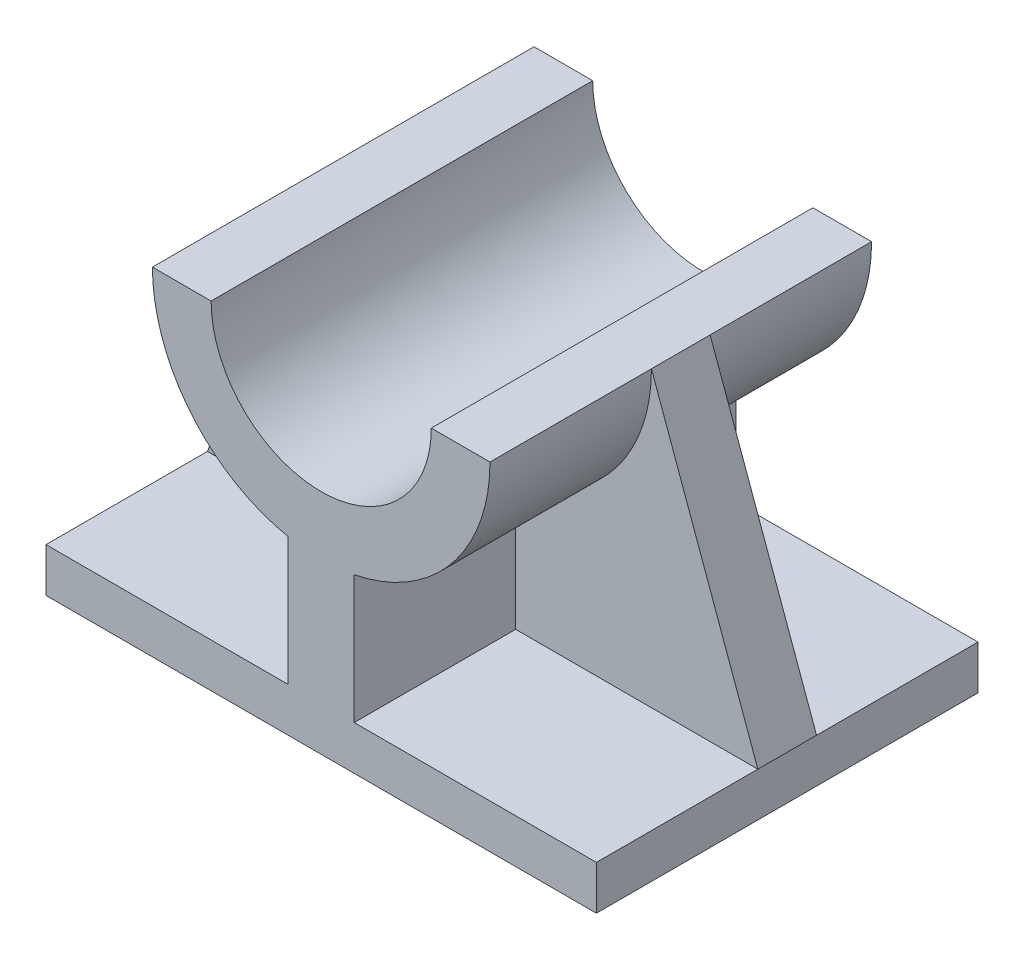
ISO-10303-21;
HEADER;
FILE_DESCRIPTION(('STEP AP214'),'2;1');
FILE_NAME('part.step','',(''),(''),'','','');
FILE_SCHEMA(('AUTOMOTIVE_DESIGN { 1 0 10303 214 1 1 1 1 }'));
ENDSEC;
DATA;
#1=APPLICATION_CONTEXT('core data for automotive mechanical design processes');
#2=APPLICATION_PROTOCOL_DEFINITION('international standard','automotive_design',2000,#1);
#3=PRODUCT_CONTEXT('',#1,'mechanical');
#4=PRODUCT('Part','Part','',(#3));
#5=PRODUCT_RELATED_PRODUCT_CATEGORY('part','',(#4));
#6=PRODUCT_DEFINITION_FORMATION('','',#4);
#7=PRODUCT_DEFINITION_CONTEXT('part definition',#1,'design');
#8=PRODUCT_DEFINITION('design','',#6,#7);
#9=PRODUCT_DEFINITION_SHAPE('','',#8);
#10=(LENGTH_UNIT() NAMED_UNIT(*) SI_UNIT(.MILLI.,.METRE.));
#11=(NAMED_UNIT(*) PLANE_ANGLE_UNIT() SI_UNIT($,.RADIAN.));
#12=(NAMED_UNIT(*) SI_UNIT($,.STERADIAN.) SOLID_ANGLE_UNIT());
#13=UNCERTAINTY_MEASURE_WITH_UNIT(LENGTH_MEASURE(1.E-05),#10,'distance_accuracy_value','');
#14=(GEOMETRIC_REPRESENTATION_CONTEXT(3) GLOBAL_UNCERTAINTY_ASSIGNED_CONTEXT((#13)) GLOBAL_UNIT_ASSIGNED_CONTEXT((#10,
#11,#12)) REPRESENTATION_CONTEXT('',''));
#15=CARTESIAN_POINT('',(0.,0.,0.));
#16=DIRECTION('',(0.,0.,1.));
#17=DIRECTION('',(1.,0.,0.));
#18=AXIS2_PLACEMENT_3D('',#15,#16,#17);
#19=CARTESIAN_POINT('',(0.,43.,26.));
#20=DIRECTION('',(0.,0.,-1.));
#21=DIRECTION('',(-1.,0.,0.));
#22=AXIS2_PLACEMENT_3D('',#19,#20,#21);
#23=CYLINDRICAL_SURFACE('',#22,23.);
#24=CARTESIAN_POINT('',(0.,43.,-4.));
#25=DIRECTION('',(0.,0.,1.));
#26=DIRECTION('',(1.,0.,0.));
#27=AXIS2_PLACEMENT_3D('',#24,#25,#26);
#28=CIRCLE('',#27,23.);
#29=CARTESIAN_POINT('',(-23.,43.,-4.));
#30=VERTEX_POINT('',#29);
#31=CARTESIAN_POINT('',(-4.5,20.4445128627201,-4.));
#32=VERTEX_POINT('',#31);
#33=EDGE_CURVE('E194',#30,#32,#28,.T.);
#34=ORIENTED_EDGE('',*,*,#33,.F.);
#35=DIRECTION('',(0.,0.,-1.));
#36=VECTOR('',#35,1.);
#37=CARTESIAN_POINT('',(-23.,43.,26.));
#38=LINE('',#37,#36);
#39=CARTESIAN_POINT('',(-23.,43.,-26.));
#40=VERTEX_POINT('',#39);
#41=EDGE_CURVE('E53',#30,#40,#38,.T.);
#42=ORIENTED_EDGE('',*,*,#41,.T.);
#43=CARTESIAN_POINT('',(0.,43.,-26.));
#44=DIRECTION('',(0.,0.,1.));
#45=DIRECTION('',(1.,0.,0.));
#46=AXIS2_PLACEMENT_3D('',#43,#44,#45);
#47=CIRCLE('',#46,23.);
#48=CARTESIAN_POINT('',(-4.5,20.4445128627201,-26.));
#49=VERTEX_POINT('',#48);
#50=EDGE_CURVE('E218',#40,#49,#47,.T.);
#51=ORIENTED_EDGE('',*,*,#50,.T.);
#52=DIRECTION('',(0.,0.,-1.));
#53=VECTOR('',#52,1.);
#54=CARTESIAN_POINT('',(-4.5,20.4445128627201,26.));
#55=LINE('',#54,#53);
#56=EDGE_CURVE('E205',#32,#49,#55,.T.);
#57=ORIENTED_EDGE('',*,*,#56,.F.);
#58=EDGE_LOOP('',(#34,#42,#51,#57));
#59=FACE_BOUND('',#58,.T.);
#60=ADVANCED_FACE('F43',(#59),#23,.T.);
#61=CARTESIAN_POINT('',(-4.5,3.,26.));
#62=DIRECTION('',(-1.,0.,0.));
#63=DIRECTION('',(0.,0.,1.));
#64=AXIS2_PLACEMENT_3D('',#61,#62,#63);
#65=PLANE('',#64);
#66=DIRECTION('',(0.,0.,-1.));
#67=VECTOR('',#66,1.);
#68=CARTESIAN_POINT('',(-4.5,3.,26.));
#69=LINE('',#68,#67);
#70=CARTESIAN_POINT('',(-4.5,3.,-4.));
#71=VERTEX_POINT('',#70);
#72=CARTESIAN_POINT('',(-4.5,3.,-26.));
#73=VERTEX_POINT('',#72);
#74=EDGE_CURVE('E225',#71,#73,#69,.T.);
#75=ORIENTED_EDGE('',*,*,#74,.F.);
#76=DIRECTION('',(0.,1.,0.));
#77=VECTOR('',#76,1.);
#78=CARTESIAN_POINT('',(-4.5,3.,-4.));
#79=LINE('',#78,#77);
#80=EDGE_CURVE('E207',#71,#32,#79,.T.);
#81=ORIENTED_EDGE('',*,*,#80,.T.);
#82=ORIENTED_EDGE('',*,*,#56,.T.);
#83=DIRECTION('',(0.,1.,0.));
#84=VECTOR('',#83,1.);
#85=CARTESIAN_POINT('',(-4.5,3.,-26.));
#86=LINE('',#85,#84);
#87=EDGE_CURVE('E320',#73,#49,#86,.T.);
#88=ORIENTED_EDGE('',*,*,#87,.F.);
#89=EDGE_LOOP('',(#75,#81,#82,#88));
#90=FACE_BOUND('',#89,.T.);
#91=ADVANCED_FACE('F471',(#90),#65,.T.);
#92=CARTESIAN_POINT('',(-37.5,3.,26.));
#93=DIRECTION('',(0.,1.,0.));
#94=DIRECTION('',(0.,0.,1.));
#95=AXIS2_PLACEMENT_3D('',#92,#93,#94);
#96=PLANE('',#95);
#97=DIRECTION('',(0.,0.,-1.));
#98=VECTOR('',#97,1.);
#99=CARTESIAN_POINT('',(-37.5,3.,26.));
#100=LINE('',#99,#98);
#101=CARTESIAN_POINT('',(-37.5,3.,-3.99999999999999));
#102=VERTEX_POINT('',#101);
#103=CARTESIAN_POINT('',(-37.5,3.,-26.));
#104=VERTEX_POINT('',#103);
#105=EDGE_CURVE('E231',#102,#104,#100,.T.);
#106=ORIENTED_EDGE('',*,*,#105,.F.);
#107=DIRECTION('',(1.,0.,0.));
#108=VECTOR('',#107,1.);
#109=CARTESIAN_POINT('',(-37.5,3.,-4.));
#110=LINE('',#109,#108);
#111=EDGE_CURVE('E197',#102,#71,#110,.T.);
#112=ORIENTED_EDGE('',*,*,#111,.T.);
#113=ORIENTED_EDGE('',*,*,#74,.T.);
#114=DIRECTION('',(1.,0.,0.));
#115=VECTOR('',#114,1.);
#116=CARTESIAN_POINT('',(-37.5,3.,-26.));
#117=LINE('',#116,#115);
#118=EDGE_CURVE('E317',#104,#73,#117,.T.);
#119=ORIENTED_EDGE('',*,*,#118,.F.);
#120=EDGE_LOOP('',(#106,#112,#113,#119));
#121=FACE_BOUND('',#120,.T.);
#122=ADVANCED_FACE('F477',(#121),#96,.T.);
#123=CARTESIAN_POINT('',(4.5,3.,26.));
#124=DIRECTION('',(0.,1.,0.));
#125=DIRECTION('',(0.,0.,1.));
#126=AXIS2_PLACEMENT_3D('',#123,#124,#125);
#127=PLANE('',#126);
#128=DIRECTION('',(0.,0.,-1.));
#129=VECTOR('',#128,1.);
#130=CARTESIAN_POINT('',(4.5,3.,26.));
#131=LINE('',#130,#129);
#132=CARTESIAN_POINT('',(4.5,3.,-4.));
#133=VERTEX_POINT('',#132);
#134=CARTESIAN_POINT('',(4.5,3.,-26.));
#135=VERTEX_POINT('',#134);
#136=EDGE_CURVE('E247',#133,#135,#131,.T.);
#137=ORIENTED_EDGE('',*,*,#136,.F.);
#138=DIRECTION('',(1.,0.,0.));
#139=VECTOR('',#138,1.);
#140=CARTESIAN_POINT('',(4.5,3.,-4.));
#141=LINE('',#140,#139);
#142=CARTESIAN_POINT('',(37.5,3.,-4.));
#143=VERTEX_POINT('',#142);
#144=EDGE_CURVE('E394',#133,#143,#141,.T.);
#145=ORIENTED_EDGE('',*,*,#144,.T.);
#146=DIRECTION('',(0.,0.,-1.));
#147=VECTOR('',#146,1.);
#148=CARTESIAN_POINT('',(37.5,3.,26.));
#149=LINE('',#148,#147);
#150=CARTESIAN_POINT('',(37.5,3.,-26.));
#151=VERTEX_POINT('',#150);
#152=EDGE_CURVE('E242',#143,#151,#149,.T.);
#153=ORIENTED_EDGE('',*,*,#152,.T.);
#154=DIRECTION('',(1.,0.,0.));
#155=VECTOR('',#154,1.);
#156=CARTESIAN_POINT('',(4.5,3.,-26.));
#157=LINE('',#156,#155);
#158=EDGE_CURVE('E301',#135,#151,#157,.T.);
#159=ORIENTED_EDGE('',*,*,#158,.F.);
#160=EDGE_LOOP('',(#137,#145,#153,#159));
#161=FACE_BOUND('',#160,.T.);
#162=ADVANCED_FACE('F422',(#161),#127,.T.);
#163=CARTESIAN_POINT('',(4.5,3.,26.));
#164=DIRECTION('',(-1.,0.,0.));
#165=DIRECTION('',(0.,0.,1.));
#166=AXIS2_PLACEMENT_3D('',#163,#164,#165);
#167=PLANE('',#166);
#168=DIRECTION('',(0.,1.,0.));
#169=VECTOR('',#168,1.);
#170=CARTESIAN_POINT('',(4.5,3.,-4.));
#171=LINE('',#170,#169);
#172=CARTESIAN_POINT('',(4.5,20.4445128627201,-4.));
#173=VERTEX_POINT('',#172);
#174=EDGE_CURVE('E391',#133,#173,#171,.T.);
#175=ORIENTED_EDGE('',*,*,#174,.F.);
#176=ORIENTED_EDGE('',*,*,#136,.T.);
#177=DIRECTION('',(0.,1.,0.));
#178=VECTOR('',#177,1.);
#179=CARTESIAN_POINT('',(4.5,3.,-26.));
#180=LINE('',#179,#178);
#181=CARTESIAN_POINT('',(4.5,20.4445128627201,-26.));
#182=VERTEX_POINT('',#181);
#183=EDGE_CURVE('E297',#135,#182,#180,.T.);
#184=ORIENTED_EDGE('',*,*,#183,.T.);
#185=DIRECTION('',(0.,0.,-1.));
#186=VECTOR('',#185,1.);
#187=CARTESIAN_POINT('',(4.5,20.4445128627201,26.));
#188=LINE('',#187,#186);
#189=EDGE_CURVE('E252',#173,#182,#188,.T.);
#190=ORIENTED_EDGE('',*,*,#189,.F.);
#191=EDGE_LOOP('',(#175,#176,#184,#190));
#192=FACE_BOUND('',#191,.T.);
#193=ADVANCED_FACE('F457',(#192),#167,.F.);
#194=CARTESIAN_POINT('',(0.,43.,26.));
#195=DIRECTION('',(0.,0.,-1.));
#196=DIRECTION('',(-1.,0.,0.));
#197=AXIS2_PLACEMENT_3D('',#194,#195,#196);
#198=CYLINDRICAL_SURFACE('',#197,23.);
#199=CARTESIAN_POINT('',(0.,43.,-4.));
#200=DIRECTION('',(0.,0.,1.));
#201=DIRECTION('',(1.,0.,0.));
#202=AXIS2_PLACEMENT_3D('',#199,#200,#201);
#203=CIRCLE('',#202,23.);
#204=CARTESIAN_POINT('',(23.,43.,-3.99999999999999));
#205=VERTEX_POINT('',#204);
#206=EDGE_CURVE('E386',#173,#205,#203,.T.);
#207=ORIENTED_EDGE('',*,*,#206,.F.);
#208=ORIENTED_EDGE('',*,*,#189,.T.);
#209=CARTESIAN_POINT('',(0.,43.,-26.));
#210=DIRECTION('',(0.,0.,1.));
#211=DIRECTION('',(1.,0.,0.));
#212=AXIS2_PLACEMENT_3D('',#209,#210,#211);
#213=CIRCLE('',#212,23.);
#214=CARTESIAN_POINT('',(23.,43.,-26.));
#215=VERTEX_POINT('',#214);
#216=EDGE_CURVE('E293',#182,#215,#213,.T.);
#217=ORIENTED_EDGE('',*,*,#216,.T.);
#218=DIRECTION('',(0.,0.,-1.));
#219=VECTOR('',#218,1.);
#220=CARTESIAN_POINT('',(23.,43.,26.));
#221=LINE('',#220,#219);
#222=EDGE_CURVE('E257',#205,#215,#221,.T.);
#223=ORIENTED_EDGE('',*,*,#222,.F.);
#224=EDGE_LOOP('',(#207,#208,#217,#223));
#225=FACE_BOUND('',#224,.T.);
#226=ADVANCED_FACE('F459',(#225),#198,.T.);
#227=CARTESIAN_POINT('',(-23.,43.,26.));
#228=DIRECTION('',(0.,1.,0.));
#229=DIRECTION('',(0.,0.,1.));
#230=AXIS2_PLACEMENT_3D('',#227,#228,#229);
#231=PLANE('',#230);
#232=DIRECTION('',(0.,0.,-1.));
#233=VECTOR('',#232,1.);
#234=CARTESIAN_POINT('',(-15.,43.,26.));
#235=LINE('',#234,#233);
#236=CARTESIAN_POINT('',(-15.,43.,26.));
#237=VERTEX_POINT('',#236);
#238=CARTESIAN_POINT('',(-15.,43.,-26.));
#239=VERTEX_POINT('',#238);
#240=EDGE_CURVE('E47',#237,#239,#235,.T.);
#241=ORIENTED_EDGE('',*,*,#240,.T.);
#242=DIRECTION('',(1.,0.,0.));
#243=VECTOR('',#242,1.);
#244=CARTESIAN_POINT('',(-23.,43.,-26.));
#245=LINE('',#244,#243);
#246=EDGE_CURVE('E211',#40,#239,#245,.T.);
#247=ORIENTED_EDGE('',*,*,#246,.F.);
#248=ORIENTED_EDGE('',*,*,#41,.F.);
#249=DIRECTION('',(0.,0.,-1.));
#250=VECTOR('',#249,1.);
#251=CARTESIAN_POINT('',(-23.,43.,26.));
#252=LINE('',#251,#250);
#253=CARTESIAN_POINT('',(-23.,43.,4.));
#254=VERTEX_POINT('',#253);
#255=EDGE_CURVE('E182',#30,#254,#252,.F.);
#256=ORIENTED_EDGE('',*,*,#255,.T.);
#257=CARTESIAN_POINT('',(-23.,43.,26.));
#258=VERTEX_POINT('',#257);
#259=EDGE_CURVE('E11',#258,#254,#38,.T.);
#260=ORIENTED_EDGE('',*,*,#259,.F.);
#261=DIRECTION('',(1.,0.,0.));
#262=VECTOR('',#261,1.);
#263=CARTESIAN_POINT('',(-23.,43.,26.));
#264=LINE('',#263,#262);
#265=EDGE_CURVE('E326',#258,#237,#264,.T.);
#266=ORIENTED_EDGE('',*,*,#265,.T.);
#267=EDGE_LOOP('',(#241,#247,#248,#256,#260,#266));
#268=FACE_BOUND('',#267,.T.);
#269=ADVANCED_FACE('F45',(#268),#231,.T.);
#270=ORIENTED_EDGE('',*,*,#259,.T.);
#271=CARTESIAN_POINT('',(0.,43.,4.));
#272=DIRECTION('',(0.,0.,1.));
#273=DIRECTION('',(1.,0.,0.));
#274=AXIS2_PLACEMENT_3D('',#271,#272,#273);
#275=CIRCLE('',#274,23.);
#276=CARTESIAN_POINT('',(-4.5,20.4445128627201,4.));
#277=VERTEX_POINT('',#276);
#278=EDGE_CURVE('E374',#254,#277,#275,.T.);
#279=ORIENTED_EDGE('',*,*,#278,.T.);
#280=CARTESIAN_POINT('',(-4.5,20.4445128627201,26.));
#281=VERTEX_POINT('',#280);
#282=EDGE_CURVE('E213',#281,#277,#55,.T.);
#283=ORIENTED_EDGE('',*,*,#282,.F.);
#284=CARTESIAN_POINT('',(0.,43.,26.));
#285=DIRECTION('',(0.,0.,1.));
#286=DIRECTION('',(1.,0.,0.));
#287=AXIS2_PLACEMENT_3D('',#284,#285,#286);
#288=CIRCLE('',#287,23.);
#289=EDGE_CURVE('E266',#258,#281,#288,.T.);
#290=ORIENTED_EDGE('',*,*,#289,.F.);
#291=EDGE_LOOP('',(#270,#279,#283,#290));
#292=FACE_BOUND('',#291,.T.);
#293=ADVANCED_FACE('F473',(#292),#23,.T.);
#294=DIRECTION('',(0.,1.,0.));
#295=VECTOR('',#294,1.);
#296=CARTESIAN_POINT('',(-4.5,3.,4.));
#297=LINE('',#296,#295);
#298=CARTESIAN_POINT('',(-4.5,3.,4.));
#299=VERTEX_POINT('',#298);
#300=EDGE_CURVE('E370',#299,#277,#297,.T.);
#301=ORIENTED_EDGE('',*,*,#300,.F.);
#302=CARTESIAN_POINT('',(-4.5,3.,26.));
#303=VERTEX_POINT('',#302);
#304=EDGE_CURVE('E221',#303,#299,#69,.T.);
#305=ORIENTED_EDGE('',*,*,#304,.F.);
#306=DIRECTION('',(0.,1.,0.));
#307=VECTOR('',#306,1.);
#308=CARTESIAN_POINT('',(-4.5,3.,26.));
#309=LINE('',#308,#307);
#310=EDGE_CURVE('E269',#303,#281,#309,.T.);
#311=ORIENTED_EDGE('',*,*,#310,.T.);
#312=ORIENTED_EDGE('',*,*,#282,.T.);
#313=EDGE_LOOP('',(#301,#305,#311,#312));
#314=FACE_BOUND('',#313,.T.);
#315=ADVANCED_FACE('F369',(#314),#65,.T.);
#316=DIRECTION('',(1.,0.,0.));
#317=VECTOR('',#316,1.);
#318=CARTESIAN_POINT('',(-37.5,3.,4.));
#319=LINE('',#318,#317);
#320=CARTESIAN_POINT('',(-37.5,3.00000000000003,4.));
#321=VERTEX_POINT('',#320);
#322=EDGE_CURVE('E189',#321,#299,#319,.T.);
#323=ORIENTED_EDGE('',*,*,#322,.F.);
#324=CARTESIAN_POINT('',(-37.5,3.,26.));
#325=VERTEX_POINT('',#324);
#326=EDGE_CURVE('E226',#325,#321,#100,.T.);
#327=ORIENTED_EDGE('',*,*,#326,.F.);
#328=DIRECTION('',(1.,0.,0.));
#329=VECTOR('',#328,1.);
#330=CARTESIAN_POINT('',(-37.5,3.,26.));
#331=LINE('',#330,#329);
#332=EDGE_CURVE('E278',#325,#303,#331,.T.);
#333=ORIENTED_EDGE('',*,*,#332,.T.);
#334=ORIENTED_EDGE('',*,*,#304,.T.);
#335=EDGE_LOOP('',(#323,#327,#333,#334));
#336=FACE_BOUND('',#335,.T.);
#337=ADVANCED_FACE('F363',(#336),#96,.T.);
#338=CARTESIAN_POINT('',(-37.5,3.,26.));
#339=DIRECTION('',(1.,0.,0.));
#340=DIRECTION('',(0.,0.,-1.));
#341=AXIS2_PLACEMENT_3D('',#338,#339,#340);
#342=PLANE('',#341);
#343=ORIENTED_EDGE('',*,*,#326,.T.);
#344=EDGE_CURVE('E230',#321,#102,#100,.T.);
#345=ORIENTED_EDGE('',*,*,#344,.T.);
#346=ORIENTED_EDGE('',*,*,#105,.T.);
#347=DIRECTION('',(0.,-1.,0.));
#348=VECTOR('',#347,1.);
#349=CARTESIAN_POINT('',(-37.5,3.,-26.));
#350=LINE('',#349,#348);
#351=CARTESIAN_POINT('',(-37.5,-3.,-26.));
#352=VERTEX_POINT('',#351);
#353=EDGE_CURVE('E313',#104,#352,#350,.T.);
#354=ORIENTED_EDGE('',*,*,#353,.T.);
#355=DIRECTION('',(0.,0.,-1.));
#356=VECTOR('',#355,1.);
#357=CARTESIAN_POINT('',(-37.5,-3.,26.));
#358=LINE('',#357,#356);
#359=CARTESIAN_POINT('',(-37.5,-3.,26.));
#360=VERTEX_POINT('',#359);
#361=EDGE_CURVE('E232',#360,#352,#358,.T.);
#362=ORIENTED_EDGE('',*,*,#361,.F.);
#363=DIRECTION('',(0.,-1.,0.));
#364=VECTOR('',#363,1.);
#365=CARTESIAN_POINT('',(-37.5,3.,26.));
#366=LINE('',#365,#364);
#367=EDGE_CURVE('E356',#325,#360,#366,.T.);
#368=ORIENTED_EDGE('',*,*,#367,.F.);
#369=EDGE_LOOP('',(#343,#345,#346,#354,#362,#368));
#370=FACE_BOUND('',#369,.T.);
#371=ADVANCED_FACE('F492',(#370),#342,.F.);
#372=CARTESIAN_POINT('',(-37.5,-3.,26.));
#373=DIRECTION('',(0.,1.,0.));
#374=DIRECTION('',(0.,0.,1.));
#375=AXIS2_PLACEMENT_3D('',#372,#373,#374);
#376=PLANE('',#375);
#377=ORIENTED_EDGE('',*,*,#361,.T.);
#378=DIRECTION('',(1.,0.,0.));
#379=VECTOR('',#378,1.);
#380=CARTESIAN_POINT('',(-37.5,-3.,-26.));
#381=LINE('',#380,#379);
#382=CARTESIAN_POINT('',(37.5,-3.,-26.));
#383=VERTEX_POINT('',#382);
#384=EDGE_CURVE('E309',#352,#383,#381,.T.);
#385=ORIENTED_EDGE('',*,*,#384,.T.);
#386=DIRECTION('',(0.,0.,-1.));
#387=VECTOR('',#386,1.);
#388=CARTESIAN_POINT('',(37.5,-3.,26.));
#389=LINE('',#388,#387);
#390=CARTESIAN_POINT('',(37.5,-3.,26.));
#391=VERTEX_POINT('',#390);
#392=EDGE_CURVE('E235',#391,#383,#389,.T.);
#393=ORIENTED_EDGE('',*,*,#392,.F.);
#394=DIRECTION('',(1.,0.,0.));
#395=VECTOR('',#394,1.);
#396=CARTESIAN_POINT('',(-37.5,-3.,26.));
#397=LINE('',#396,#395);
#398=EDGE_CURVE('E353',#360,#391,#397,.T.);
#399=ORIENTED_EDGE('',*,*,#398,.F.);
#400=EDGE_LOOP('',(#377,#385,#393,#399));
#401=FACE_BOUND('',#400,.T.);
#402=ADVANCED_FACE('F449',(#401),#376,.F.);
#403=CARTESIAN_POINT('',(37.5,3.,26.));
#404=DIRECTION('',(1.,0.,0.));
#405=DIRECTION('',(0.,0.,-1.));
#406=AXIS2_PLACEMENT_3D('',#403,#404,#405);
#407=PLANE('',#406);
#408=ORIENTED_EDGE('',*,*,#392,.T.);
#409=DIRECTION('',(0.,-1.,0.));
#410=VECTOR('',#409,1.);
#411=CARTESIAN_POINT('',(37.5,3.,-26.));
#412=LINE('',#411,#410);
#413=EDGE_CURVE('E305',#151,#383,#412,.T.);
#414=ORIENTED_EDGE('',*,*,#413,.F.);
#415=ORIENTED_EDGE('',*,*,#152,.F.);
#416=DIRECTION('',(0.,0.,1.));
#417=VECTOR('',#416,1.);
#418=CARTESIAN_POINT('',(37.5,3.,26.));
#419=LINE('',#418,#417);
#420=CARTESIAN_POINT('',(37.5,3.,4.));
#421=VERTEX_POINT('',#420);
#422=EDGE_CURVE('E285',#421,#143,#419,.F.);
#423=ORIENTED_EDGE('',*,*,#422,.F.);
#424=CARTESIAN_POINT('',(37.5,3.,26.));
#425=VERTEX_POINT('',#424);
#426=EDGE_CURVE('E238',#425,#421,#149,.T.);
#427=ORIENTED_EDGE('',*,*,#426,.F.);
#428=DIRECTION('',(0.,-1.,0.));
#429=VECTOR('',#428,1.);
#430=CARTESIAN_POINT('',(37.5,3.,26.));
#431=LINE('',#430,#429);
#432=EDGE_CURVE('E349',#425,#391,#431,.T.);
#433=ORIENTED_EDGE('',*,*,#432,.T.);
#434=EDGE_LOOP('',(#408,#414,#415,#423,#427,#433));
#435=FACE_BOUND('',#434,.T.);
#436=ADVANCED_FACE('F425',(#435),#407,.T.);
#437=DIRECTION('',(1.,0.,0.));
#438=VECTOR('',#437,1.);
#439=CARTESIAN_POINT('',(4.5,3.,4.));
#440=LINE('',#439,#438);
#441=CARTESIAN_POINT('',(4.5,3.,4.));
#442=VERTEX_POINT('',#441);
#443=EDGE_CURVE('E405',#442,#421,#440,.T.);
#444=ORIENTED_EDGE('',*,*,#443,.F.);
#445=CARTESIAN_POINT('',(4.5,3.,26.));
#446=VERTEX_POINT('',#445);
#447=EDGE_CURVE('E243',#446,#442,#131,.T.);
#448=ORIENTED_EDGE('',*,*,#447,.F.);
#449=DIRECTION('',(1.,0.,0.));
#450=VECTOR('',#449,1.);
#451=CARTESIAN_POINT('',(4.5,3.,26.));
#452=LINE('',#451,#450);
#453=EDGE_CURVE('E345',#446,#425,#452,.T.);
#454=ORIENTED_EDGE('',*,*,#453,.T.);
#455=ORIENTED_EDGE('',*,*,#426,.T.);
#456=EDGE_LOOP('',(#444,#448,#454,#455));
#457=FACE_BOUND('',#456,.T.);
#458=ADVANCED_FACE('F444',(#457),#127,.T.);
#459=ORIENTED_EDGE('',*,*,#447,.T.);
#460=DIRECTION('',(0.,1.,0.));
#461=VECTOR('',#460,1.);
#462=CARTESIAN_POINT('',(4.5,3.,4.));
#463=LINE('',#462,#461);
#464=CARTESIAN_POINT('',(4.5,20.4445128627201,4.));
#465=VERTEX_POINT('',#464);
#466=EDGE_CURVE('E402',#442,#465,#463,.T.);
#467=ORIENTED_EDGE('',*,*,#466,.T.);
#468=CARTESIAN_POINT('',(4.5,20.4445128627201,26.));
#469=VERTEX_POINT('',#468);
#470=EDGE_CURVE('E248',#469,#465,#188,.T.);
#471=ORIENTED_EDGE('',*,*,#470,.F.);
#472=DIRECTION('',(0.,1.,0.));
#473=VECTOR('',#472,1.);
#474=CARTESIAN_POINT('',(4.5,3.,26.));
#475=LINE('',#474,#473);
#476=EDGE_CURVE('E342',#446,#469,#475,.T.);
#477=ORIENTED_EDGE('',*,*,#476,.F.);
#478=EDGE_LOOP('',(#459,#467,#471,#477));
#479=FACE_BOUND('',#478,.T.);
#480=ADVANCED_FACE('F441',(#479),#167,.F.);
#481=ORIENTED_EDGE('',*,*,#470,.T.);
#482=CARTESIAN_POINT('',(0.,43.,4.));
#483=DIRECTION('',(0.,0.,1.));
#484=DIRECTION('',(1.,0.,0.));
#485=AXIS2_PLACEMENT_3D('',#482,#483,#484);
#486=CIRCLE('',#485,23.);
#487=CARTESIAN_POINT('',(23.,43.,4.));
#488=VERTEX_POINT('',#487);
#489=EDGE_CURVE('E398',#465,#488,#486,.T.);
#490=ORIENTED_EDGE('',*,*,#489,.T.);
#491=CARTESIAN_POINT('',(23.,43.,26.));
#492=VERTEX_POINT('',#491);
#493=EDGE_CURVE('E253',#492,#488,#221,.T.);
#494=ORIENTED_EDGE('',*,*,#493,.F.);
#495=CARTESIAN_POINT('',(0.,43.,26.));
#496=DIRECTION('',(0.,0.,1.));
#497=DIRECTION('',(1.,0.,0.));
#498=AXIS2_PLACEMENT_3D('',#495,#496,#497);
#499=CIRCLE('',#498,23.);
#500=EDGE_CURVE('E339',#469,#492,#499,.T.);
#501=ORIENTED_EDGE('',*,*,#500,.F.);
#502=EDGE_LOOP('',(#481,#490,#494,#501));
#503=FACE_BOUND('',#502,.T.);
#504=ADVANCED_FACE('F436',(#503),#198,.T.);
#505=CARTESIAN_POINT('',(15.,43.,26.));
#506=DIRECTION('',(0.,1.,0.));
#507=DIRECTION('',(0.,0.,1.));
#508=AXIS2_PLACEMENT_3D('',#505,#506,#507);
#509=PLANE('',#508);
#510=ORIENTED_EDGE('',*,*,#493,.T.);
#511=EDGE_CURVE('E256',#488,#205,#221,.T.);
#512=ORIENTED_EDGE('',*,*,#511,.T.);
#513=ORIENTED_EDGE('',*,*,#222,.T.);
#514=DIRECTION('',(1.,0.,0.));
#515=VECTOR('',#514,1.);
#516=CARTESIAN_POINT('',(15.,43.,-26.));
#517=LINE('',#516,#515);
#518=CARTESIAN_POINT('',(15.,43.,-26.));
#519=VERTEX_POINT('',#518);
#520=EDGE_CURVE('E289',#519,#215,#517,.T.);
#521=ORIENTED_EDGE('',*,*,#520,.F.);
#522=DIRECTION('',(0.,0.,-1.));
#523=VECTOR('',#522,1.);
#524=CARTESIAN_POINT('',(15.,43.,26.));
#525=LINE('',#524,#523);
#526=CARTESIAN_POINT('',(15.,43.,26.));
#527=VERTEX_POINT('',#526);
#528=EDGE_CURVE('E258',#527,#519,#525,.T.);
#529=ORIENTED_EDGE('',*,*,#528,.F.);
#530=DIRECTION('',(1.,0.,0.));
#531=VECTOR('',#530,1.);
#532=CARTESIAN_POINT('',(15.,43.,26.));
#533=LINE('',#532,#531);
#534=EDGE_CURVE('E331',#527,#492,#533,.T.);
#535=ORIENTED_EDGE('',*,*,#534,.T.);
#536=EDGE_LOOP('',(#510,#512,#513,#521,#529,#535));
#537=FACE_BOUND('',#536,.T.);
#538=ADVANCED_FACE('F432',(#537),#509,.T.);
#539=CARTESIAN_POINT('',(0.,43.,26.));
#540=DIRECTION('',(0.,0.,-1.));
#541=DIRECTION('',(-1.,0.,0.));
#542=AXIS2_PLACEMENT_3D('',#539,#540,#541);
#543=CYLINDRICAL_SURFACE('',#542,15.);
#544=ORIENTED_EDGE('',*,*,#528,.T.);
#545=CARTESIAN_POINT('',(0.,43.,-26.));
#546=DIRECTION('',(0.,0.,1.));
#547=DIRECTION('',(1.,0.,0.));
#548=AXIS2_PLACEMENT_3D('',#545,#546,#547);
#549=CIRCLE('',#548,15.);
#550=EDGE_CURVE('E284',#239,#519,#549,.T.);
#551=ORIENTED_EDGE('',*,*,#550,.F.);
#552=ORIENTED_EDGE('',*,*,#240,.F.);
#553=CARTESIAN_POINT('',(0.,43.,26.));
#554=DIRECTION('',(0.,0.,1.));
#555=DIRECTION('',(1.,0.,0.));
#556=AXIS2_PLACEMENT_3D('',#553,#554,#555);
#557=CIRCLE('',#556,15.);
#558=EDGE_CURVE('E328',#237,#527,#557,.T.);
#559=ORIENTED_EDGE('',*,*,#558,.T.);
#560=EDGE_LOOP('',(#544,#551,#552,#559));
#561=FACE_BOUND('',#560,.T.);
#562=ADVANCED_FACE('F462',(#561),#543,.F.);
#563=CARTESIAN_POINT('',(0.,43.,26.));
#564=DIRECTION('',(0.,0.,1.));
#565=DIRECTION('',(1.,0.,0.));
#566=AXIS2_PLACEMENT_3D('',#563,#564,#565);
#567=PLANE('',#566);
#568=ORIENTED_EDGE('',*,*,#265,.F.);
#569=ORIENTED_EDGE('',*,*,#289,.T.);
#570=ORIENTED_EDGE('',*,*,#310,.F.);
#571=ORIENTED_EDGE('',*,*,#332,.F.);
#572=ORIENTED_EDGE('',*,*,#367,.T.);
#573=ORIENTED_EDGE('',*,*,#398,.T.);
#574=ORIENTED_EDGE('',*,*,#432,.F.);
#575=ORIENTED_EDGE('',*,*,#453,.F.);
#576=ORIENTED_EDGE('',*,*,#476,.T.);
#577=ORIENTED_EDGE('',*,*,#500,.T.);
#578=ORIENTED_EDGE('',*,*,#534,.F.);
#579=ORIENTED_EDGE('',*,*,#558,.F.);
#580=EDGE_LOOP('',(#568,#569,#570,#571,#572,#573,#574,#575,#576,#577,#578,#579));
#581=FACE_BOUND('',#580,.T.);
#582=ADVANCED_FACE('F365',(#581),#567,.T.);
#583=CARTESIAN_POINT('',(0.,43.,-26.));
#584=DIRECTION('',(0.,0.,1.));
#585=DIRECTION('',(1.,0.,0.));
#586=AXIS2_PLACEMENT_3D('',#583,#584,#585);
#587=PLANE('',#586);
#588=ORIENTED_EDGE('',*,*,#246,.T.);
#589=ORIENTED_EDGE('',*,*,#550,.T.);
#590=ORIENTED_EDGE('',*,*,#520,.T.);
#591=ORIENTED_EDGE('',*,*,#216,.F.);
#592=ORIENTED_EDGE('',*,*,#183,.F.);
#593=ORIENTED_EDGE('',*,*,#158,.T.);
#594=ORIENTED_EDGE('',*,*,#413,.T.);
#595=ORIENTED_EDGE('',*,*,#384,.F.);
#596=ORIENTED_EDGE('',*,*,#353,.F.);
#597=ORIENTED_EDGE('',*,*,#118,.T.);
#598=ORIENTED_EDGE('',*,*,#87,.T.);
#599=ORIENTED_EDGE('',*,*,#50,.F.);
#600=EDGE_LOOP('',(#588,#589,#590,#591,#592,#593,#594,#595,#596,#597,#598,#599));
#601=FACE_BOUND('',#600,.T.);
#602=ADVANCED_FACE('F452',(#601),#587,.F.);
#603=CARTESIAN_POINT('',(23.,43.,0.));
#604=DIRECTION('',(-0.940136065162483,-0.3407993236214,0.));
#605=DIRECTION('',(0.3407993236214,-0.940136065162483,0.));
#606=AXIS2_PLACEMENT_3D('',#603,#604,#605);
#607=PLANE('',#606);
#608=DIRECTION('',(0.3407993236214,-0.940136065162483,0.));
#609=VECTOR('',#608,1.);
#610=CARTESIAN_POINT('',(23.,43.,4.));
#611=LINE('',#610,#609);
#612=EDGE_CURVE('E382',#488,#421,#611,.T.);
#613=ORIENTED_EDGE('',*,*,#612,.T.);
#614=ORIENTED_EDGE('',*,*,#422,.T.);
#615=DIRECTION('',(0.3407993236214,-0.940136065162483,0.));
#616=VECTOR('',#615,1.);
#617=CARTESIAN_POINT('',(23.,43.,-4.));
#618=LINE('',#617,#616);
#619=EDGE_CURVE('E69',#205,#143,#618,.T.);
#620=ORIENTED_EDGE('',*,*,#619,.F.);
#621=ORIENTED_EDGE('',*,*,#511,.F.);
#622=EDGE_LOOP('',(#613,#614,#620,#621));
#623=FACE_BOUND('',#622,.T.);
#624=ADVANCED_FACE('F412',(#623),#607,.F.);
#625=CARTESIAN_POINT('',(0.,20.,4.));
#626=DIRECTION('',(0.,0.,1.));
#627=DIRECTION('',(1.,0.,0.));
#628=AXIS2_PLACEMENT_3D('',#625,#626,#627);
#629=PLANE('',#628);
#630=ORIENTED_EDGE('',*,*,#466,.F.);
#631=ORIENTED_EDGE('',*,*,#443,.T.);
#632=ORIENTED_EDGE('',*,*,#612,.F.);
#633=ORIENTED_EDGE('',*,*,#489,.F.);
#634=EDGE_LOOP('',(#630,#631,#632,#633));
#635=FACE_BOUND('',#634,.T.);
#636=ADVANCED_FACE('F434',(#635),#629,.T.);
#637=CARTESIAN_POINT('',(0.,20.,-4.));
#638=DIRECTION('',(0.,0.,1.));
#639=DIRECTION('',(1.,0.,0.));
#640=AXIS2_PLACEMENT_3D('',#637,#638,#639);
#641=PLANE('',#640);
#642=ORIENTED_EDGE('',*,*,#144,.F.);
#643=ORIENTED_EDGE('',*,*,#174,.T.);
#644=ORIENTED_EDGE('',*,*,#206,.T.);
#645=ORIENTED_EDGE('',*,*,#619,.T.);
#646=EDGE_LOOP('',(#642,#643,#644,#645));
#647=FACE_BOUND('',#646,.T.);
#648=ADVANCED_FACE('F416',(#647),#641,.F.);
#649=CARTESIAN_POINT('',(-23.,43.,0.));
#650=DIRECTION('',(-0.940136065162483,0.3407993236214,0.));
#651=DIRECTION('',(-0.3407993236214,-0.940136065162483,0.));
#652=AXIS2_PLACEMENT_3D('',#649,#650,#651);
#653=PLANE('',#652);
#654=ORIENTED_EDGE('',*,*,#255,.F.);
#655=DIRECTION('',(-0.3407993236214,-0.940136065162483,0.));
#656=VECTOR('',#655,1.);
#657=CARTESIAN_POINT('',(-23.,43.,-4.));
#658=LINE('',#657,#656);
#659=EDGE_CURVE('E61',#30,#102,#658,.T.);
#660=ORIENTED_EDGE('',*,*,#659,.T.);
#661=ORIENTED_EDGE('',*,*,#344,.F.);
#662=DIRECTION('',(-0.3407993236214,-0.940136065162483,0.));
#663=VECTOR('',#662,1.);
#664=CARTESIAN_POINT('',(-23.,43.,4.));
#665=LINE('',#664,#663);
#666=EDGE_CURVE('E185',#254,#321,#665,.T.);
#667=ORIENTED_EDGE('',*,*,#666,.F.);
#668=EDGE_LOOP('',(#654,#660,#661,#667));
#669=FACE_BOUND('',#668,.T.);
#670=ADVANCED_FACE('F183',(#669),#653,.T.);
#671=CARTESIAN_POINT('',(0.,20.,-4.));
#672=DIRECTION('',(0.,0.,1.));
#673=DIRECTION('',(1.,0.,0.));
#674=AXIS2_PLACEMENT_3D('',#671,#672,#673);
#675=PLANE('',#674);
#676=ORIENTED_EDGE('',*,*,#111,.F.);
#677=ORIENTED_EDGE('',*,*,#659,.F.);
#678=ORIENTED_EDGE('',*,*,#33,.T.);
#679=ORIENTED_EDGE('',*,*,#80,.F.);
#680=EDGE_LOOP('',(#676,#677,#678,#679));
#681=FACE_BOUND('',#680,.T.);
#682=ADVANCED_FACE('F193',(#681),#675,.F.);
#683=CARTESIAN_POINT('',(0.,20.,4.));
#684=DIRECTION('',(0.,0.,1.));
#685=DIRECTION('',(1.,0.,0.));
#686=AXIS2_PLACEMENT_3D('',#683,#684,#685);
#687=PLANE('',#686);
#688=ORIENTED_EDGE('',*,*,#666,.T.);
#689=ORIENTED_EDGE('',*,*,#322,.T.);
#690=ORIENTED_EDGE('',*,*,#300,.T.);
#691=ORIENTED_EDGE('',*,*,#278,.F.);
#692=EDGE_LOOP('',(#688,#689,#690,#691));
#693=FACE_BOUND('',#692,.T.);
#694=ADVANCED_FACE('F487',(#693),#687,.T.);
#695=CLOSED_SHELL('',(#60,#91,#122,#162,#193,#226,#269,#293,#315,#337,#371,#402,#436,#458,#480,
#504,#538,#562,#582,#602,#624,#636,#648,#670,#682,#694));
#696=MANIFOLD_SOLID_BREP('B2',#695);
#697=ADVANCED_BREP_SHAPE_REPRESENTATION('',(#18,#696),#14);
#698=SHAPE_DEFINITION_REPRESENTATION(#9,#697);
ENDSEC;
END-ISO-10303-21;
